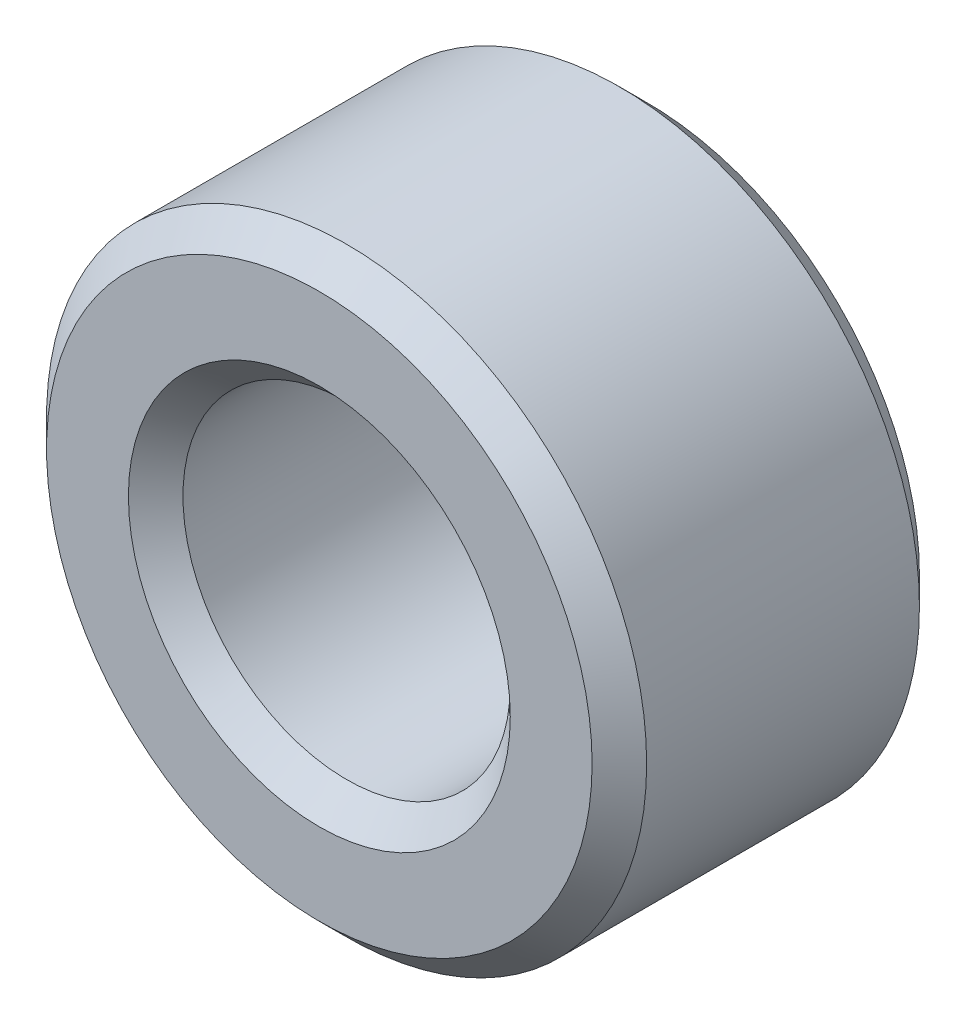
ISO-10303-21;
HEADER;
FILE_DESCRIPTION(('STEP AP214'),'2;1');
FILE_NAME('part.step','',(''),(''),'','','');
FILE_SCHEMA(('AUTOMOTIVE_DESIGN { 1 0 10303 214 1 1 1 1 }'));
ENDSEC;
DATA;
#1=APPLICATION_CONTEXT('core data for automotive mechanical design processes');
#2=APPLICATION_PROTOCOL_DEFINITION('international standard','automotive_design',2000,#1);
#3=PRODUCT_CONTEXT('',#1,'mechanical');
#4=PRODUCT('Part','Part','',(#3));
#5=PRODUCT_RELATED_PRODUCT_CATEGORY('part','',(#4));
#6=PRODUCT_DEFINITION_FORMATION('','',#4);
#7=PRODUCT_DEFINITION_CONTEXT('part definition',#1,'design');
#8=PRODUCT_DEFINITION('design','',#6,#7);
#9=PRODUCT_DEFINITION_SHAPE('','',#8);
#10=(LENGTH_UNIT() NAMED_UNIT(*) SI_UNIT(.MILLI.,.METRE.));
#11=(NAMED_UNIT(*) PLANE_ANGLE_UNIT() SI_UNIT($,.RADIAN.));
#12=(NAMED_UNIT(*) SI_UNIT($,.STERADIAN.) SOLID_ANGLE_UNIT());
#13=UNCERTAINTY_MEASURE_WITH_UNIT(LENGTH_MEASURE(1.E-05),#10,'distance_accuracy_value','');
#14=(GEOMETRIC_REPRESENTATION_CONTEXT(3) GLOBAL_UNCERTAINTY_ASSIGNED_CONTEXT((#13)) GLOBAL_UNIT_ASSIGNED_CONTEXT((#10,
#11,#12)) REPRESENTATION_CONTEXT('',''));
#15=CARTESIAN_POINT('',(0.,0.,0.));
#16=DIRECTION('',(0.,0.,1.));
#17=DIRECTION('',(1.,0.,0.));
#18=AXIS2_PLACEMENT_3D('',#15,#16,#17);
#19=CARTESIAN_POINT('',(0.,0.,6.));
#20=DIRECTION('',(0.,0.,1.));
#21=DIRECTION('',(1.,0.,0.));
#22=AXIS2_PLACEMENT_3D('',#19,#20,#21);
#23=PLANE('',#22);
#24=CARTESIAN_POINT('',(0.,0.,6.));
#25=DIRECTION('',(0.,0.,1.));
#26=DIRECTION('',(1.,0.,0.));
#27=AXIS2_PLACEMENT_3D('',#24,#25,#26);
#28=CIRCLE('',#27,3.5);
#29=CARTESIAN_POINT('',(3.5,0.,6.));
#30=VERTEX_POINT('',#29);
#31=EDGE_CURVE('E51',#30,#30,#28,.F.);
#32=ORIENTED_EDGE('',*,*,#31,.T.);
#33=EDGE_LOOP('',(#32));
#34=FACE_BOUND('',#33,.T.);
#35=CARTESIAN_POINT('',(0.,0.,6.));
#36=DIRECTION('',(0.,0.,1.));
#37=DIRECTION('',(1.,0.,0.));
#38=AXIS2_PLACEMENT_3D('',#35,#36,#37);
#39=CIRCLE('',#38,5.);
#40=CARTESIAN_POINT('',(5.,0.,6.));
#41=VERTEX_POINT('',#40);
#42=EDGE_CURVE('E54',#41,#41,#39,.T.);
#43=ORIENTED_EDGE('',*,*,#42,.T.);
#44=EDGE_LOOP('',(#43));
#45=FACE_BOUND('',#44,.T.);
#46=ADVANCED_FACE('F31',(#34,#45),#23,.T.);
#47=CARTESIAN_POINT('',(0.,0.,0.));
#48=DIRECTION('',(0.,0.,1.));
#49=DIRECTION('',(1.,0.,0.));
#50=AXIS2_PLACEMENT_3D('',#47,#48,#49);
#51=PLANE('',#50);
#52=CARTESIAN_POINT('',(0.,0.,0.));
#53=DIRECTION('',(0.,0.,1.));
#54=DIRECTION('',(1.,0.,0.));
#55=AXIS2_PLACEMENT_3D('',#52,#53,#54);
#56=CIRCLE('',#55,3.5);
#57=CARTESIAN_POINT('',(3.5,0.,0.));
#58=VERTEX_POINT('',#57);
#59=EDGE_CURVE('E42',#58,#58,#56,.T.);
#60=ORIENTED_EDGE('',*,*,#59,.T.);
#61=EDGE_LOOP('',(#60));
#62=FACE_BOUND('',#61,.T.);
#63=CARTESIAN_POINT('',(0.,0.,0.));
#64=DIRECTION('',(0.,0.,1.));
#65=DIRECTION('',(1.,0.,0.));
#66=AXIS2_PLACEMENT_3D('',#63,#64,#65);
#67=CIRCLE('',#66,5.);
#68=CARTESIAN_POINT('',(5.,0.,0.));
#69=VERTEX_POINT('',#68);
#70=EDGE_CURVE('E46',#69,#69,#67,.F.);
#71=ORIENTED_EDGE('',*,*,#70,.T.);
#72=EDGE_LOOP('',(#71));
#73=FACE_BOUND('',#72,.T.);
#74=ADVANCED_FACE('F74',(#62,#73),#51,.F.);
#75=CARTESIAN_POINT('',(0.,0.,6.));
#76=DIRECTION('',(0.,0.,-1.));
#77=DIRECTION('',(-1.,0.,0.));
#78=AXIS2_PLACEMENT_3D('',#75,#76,#77);
#79=CYLINDRICAL_SURFACE('',#78,5.5);
#80=CARTESIAN_POINT('',(0.,0.,0.499999999999996));
#81=DIRECTION('',(0.,0.,1.));
#82=DIRECTION('',(1.,0.,0.));
#83=AXIS2_PLACEMENT_3D('',#80,#81,#82);
#84=CIRCLE('',#83,5.5);
#85=CARTESIAN_POINT('',(5.5,0.,0.499999999999996));
#86=VERTEX_POINT('',#85);
#87=EDGE_CURVE('E10',#86,#86,#84,.T.);
#88=ORIENTED_EDGE('',*,*,#87,.T.);
#89=EDGE_LOOP('',(#88));
#90=FACE_BOUND('',#89,.T.);
#91=CARTESIAN_POINT('',(0.,0.,5.5));
#92=DIRECTION('',(0.,0.,1.));
#93=DIRECTION('',(1.,0.,0.));
#94=AXIS2_PLACEMENT_3D('',#91,#92,#93);
#95=CIRCLE('',#94,5.5);
#96=CARTESIAN_POINT('',(5.5,0.,5.5));
#97=VERTEX_POINT('',#96);
#98=EDGE_CURVE('E38',#97,#97,#95,.F.);
#99=ORIENTED_EDGE('',*,*,#98,.T.);
#100=EDGE_LOOP('',(#99));
#101=FACE_BOUND('',#100,.T.);
#102=ADVANCED_FACE('F77',(#90,#101),#79,.T.);
#103=CARTESIAN_POINT('',(0.,0.,6.));
#104=DIRECTION('',(0.,0.,-1.));
#105=DIRECTION('',(-1.,0.,0.));
#106=AXIS2_PLACEMENT_3D('',#103,#104,#105);
#107=CYLINDRICAL_SURFACE('',#106,3.);
#108=CARTESIAN_POINT('',(0.,0.,5.5));
#109=DIRECTION('',(0.,0.,1.));
#110=DIRECTION('',(1.,0.,0.));
#111=AXIS2_PLACEMENT_3D('',#108,#109,#110);
#112=CIRCLE('',#111,3.);
#113=CARTESIAN_POINT('',(3.,0.,5.5));
#114=VERTEX_POINT('',#113);
#115=EDGE_CURVE('E57',#114,#114,#112,.T.);
#116=ORIENTED_EDGE('',*,*,#115,.T.);
#117=EDGE_LOOP('',(#116));
#118=FACE_BOUND('',#117,.T.);
#119=CARTESIAN_POINT('',(0.,0.,0.5));
#120=DIRECTION('',(0.,0.,1.));
#121=DIRECTION('',(1.,0.,0.));
#122=AXIS2_PLACEMENT_3D('',#119,#120,#121);
#123=CIRCLE('',#122,3.);
#124=CARTESIAN_POINT('',(3.,0.,0.5));
#125=VERTEX_POINT('',#124);
#126=EDGE_CURVE('E60',#125,#125,#123,.F.);
#127=ORIENTED_EDGE('',*,*,#126,.T.);
#128=EDGE_LOOP('',(#127));
#129=FACE_BOUND('',#128,.T.);
#130=ADVANCED_FACE('F64',(#118,#129),#107,.F.);
#131=CARTESIAN_POINT('',(0.,0.,5.5));
#132=DIRECTION('',(0.,0.,1.));
#133=DIRECTION('',(1.,0.,0.));
#134=AXIS2_PLACEMENT_3D('',#131,#132,#133);
#135=CONICAL_SURFACE('',#134,3.,0.785398163397451);
#136=ORIENTED_EDGE('',*,*,#31,.F.);
#137=EDGE_LOOP('',(#136));
#138=FACE_BOUND('',#137,.T.);
#139=ORIENTED_EDGE('',*,*,#115,.F.);
#140=EDGE_LOOP('',(#139));
#141=FACE_BOUND('',#140,.T.);
#142=ADVANCED_FACE('F70',(#138,#141),#135,.F.);
#143=CARTESIAN_POINT('',(0.,0.,0.));
#144=DIRECTION('',(0.,0.,-1.));
#145=DIRECTION('',(-1.,0.,0.));
#146=AXIS2_PLACEMENT_3D('',#143,#144,#145);
#147=CONICAL_SURFACE('',#146,3.5,0.785398163397446);
#148=ORIENTED_EDGE('',*,*,#126,.F.);
#149=EDGE_LOOP('',(#148));
#150=FACE_BOUND('',#149,.T.);
#151=ORIENTED_EDGE('',*,*,#59,.F.);
#152=EDGE_LOOP('',(#151));
#153=FACE_BOUND('',#152,.T.);
#154=ADVANCED_FACE('F66',(#150,#153),#147,.F.);
#155=CARTESIAN_POINT('',(0.,0.,0.499999999999996));
#156=DIRECTION('',(0.,0.,1.));
#157=DIRECTION('',(1.,0.,0.));
#158=AXIS2_PLACEMENT_3D('',#155,#156,#157);
#159=CONICAL_SURFACE('',#158,5.5,0.785398163397451);
#160=ORIENTED_EDGE('',*,*,#70,.F.);
#161=EDGE_LOOP('',(#160));
#162=FACE_BOUND('',#161,.T.);
#163=ORIENTED_EDGE('',*,*,#87,.F.);
#164=EDGE_LOOP('',(#163));
#165=FACE_BOUND('',#164,.T.);
#166=ADVANCED_FACE('F69',(#162,#165),#159,.T.);
#167=CARTESIAN_POINT('',(0.,0.,6.));
#168=DIRECTION('',(0.,0.,-1.));
#169=DIRECTION('',(-1.,0.,0.));
#170=AXIS2_PLACEMENT_3D('',#167,#168,#169);
#171=CONICAL_SURFACE('',#170,5.,0.785398163397447);
#172=ORIENTED_EDGE('',*,*,#98,.F.);
#173=EDGE_LOOP('',(#172));
#174=FACE_BOUND('',#173,.T.);
#175=ORIENTED_EDGE('',*,*,#42,.F.);
#176=EDGE_LOOP('',(#175));
#177=FACE_BOUND('',#176,.T.);
#178=ADVANCED_FACE('F33',(#174,#177),#171,.T.);
#179=CLOSED_SHELL('',(#46,#74,#102,#130,#142,#154,#166,#178));
#180=MANIFOLD_SOLID_BREP('B2',#179);
#181=ADVANCED_BREP_SHAPE_REPRESENTATION('',(#18,#180),#14);
#182=SHAPE_DEFINITION_REPRESENTATION(#9,#181);
ENDSEC;
END-ISO-10303-21;
